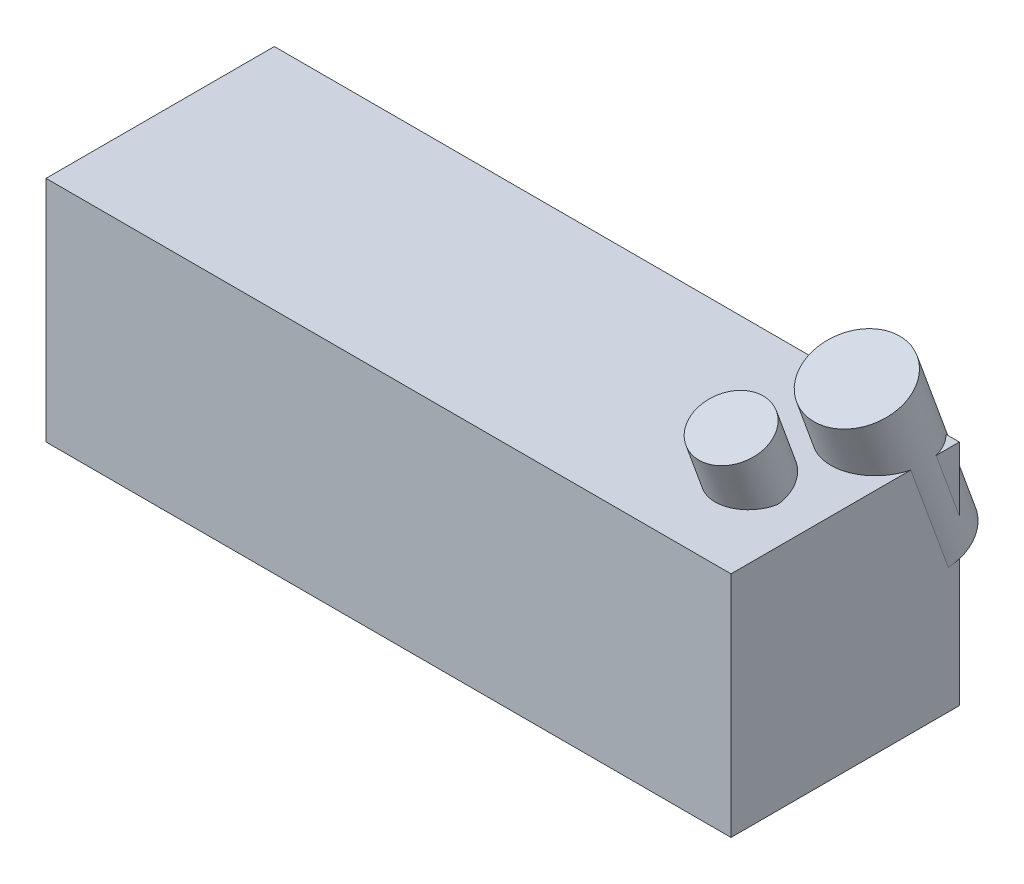
ISO-10303-21;
HEADER;
FILE_DESCRIPTION(('STEP AP214'),'2;1');
FILE_NAME('part.step','',(''),(''),'','','');
FILE_SCHEMA(('AUTOMOTIVE_DESIGN { 1 0 10303 214 1 1 1 1 }'));
ENDSEC;
DATA;
#1=APPLICATION_CONTEXT('core data for automotive mechanical design processes');
#2=APPLICATION_PROTOCOL_DEFINITION('international standard','automotive_design',2000,#1);
#3=PRODUCT_CONTEXT('',#1,'mechanical');
#4=PRODUCT('Part','Part','',(#3));
#5=PRODUCT_RELATED_PRODUCT_CATEGORY('part','',(#4));
#6=PRODUCT_DEFINITION_FORMATION('','',#4);
#7=PRODUCT_DEFINITION_CONTEXT('part definition',#1,'design');
#8=PRODUCT_DEFINITION('design','',#6,#7);
#9=PRODUCT_DEFINITION_SHAPE('','',#8);
#10=(LENGTH_UNIT() NAMED_UNIT(*) SI_UNIT(.MILLI.,.METRE.));
#11=(NAMED_UNIT(*) PLANE_ANGLE_UNIT() SI_UNIT($,.RADIAN.));
#12=(NAMED_UNIT(*) SI_UNIT($,.STERADIAN.) SOLID_ANGLE_UNIT());
#13=UNCERTAINTY_MEASURE_WITH_UNIT(LENGTH_MEASURE(1.E-05),#10,'distance_accuracy_value','');
#14=(GEOMETRIC_REPRESENTATION_CONTEXT(3) GLOBAL_UNCERTAINTY_ASSIGNED_CONTEXT((#13)) GLOBAL_UNIT_ASSIGNED_CONTEXT((#10,
#11,#12)) REPRESENTATION_CONTEXT('',''));
#15=CARTESIAN_POINT('',(0.,0.,0.));
#16=DIRECTION('',(0.,0.,1.));
#17=DIRECTION('',(1.,0.,0.));
#18=AXIS2_PLACEMENT_3D('',#15,#16,#17);
#19=CARTESIAN_POINT('',(-6.14867557934673,18.0831328357846,13.8390907622559));
#20=DIRECTION('',(0.,-0.939692620785908,-0.342020143325669));
#21=DIRECTION('',(0.,0.342020143325669,-0.939692620785908));
#22=AXIS2_PLACEMENT_3D('',#19,#20,#21);
#23=CYLINDRICAL_SURFACE('',#22,3.);
#24=CARTESIAN_POINT('',(-6.14867557934673,18.0831328357846,13.8390907622559));
#25=DIRECTION('',(0.,0.939692620785908,0.342020143325669));
#26=DIRECTION('',(0.,-0.342020143325669,0.939692620785908));
#27=AXIS2_PLACEMENT_3D('',#24,#25,#26);
#28=CIRCLE('',#27,3.);
#29=CARTESIAN_POINT('',(-6.14867557934673,17.0570724058076,16.6581686246136));
#30=VERTEX_POINT('',#29);
#31=EDGE_CURVE('E11',#30,#30,#28,.T.);
#32=ORIENTED_EDGE('',*,*,#31,.F.);
#33=EDGE_LOOP('',(#32));
#34=FACE_BOUND('',#33,.T.);
#35=CARTESIAN_POINT('',(-6.14867557934673,13.384669731855,12.1289900456275));
#36=DIRECTION('',(0.,0.939692620785908,0.342020143325669));
#37=DIRECTION('',(0.,-0.342020143325669,0.939692620785908));
#38=AXIS2_PLACEMENT_3D('',#35,#36,#37);
#39=CIRCLE('',#38,3.);
#40=CARTESIAN_POINT('',(-6.14867557934673,12.358609301878,14.9480679079853));
#41=VERTEX_POINT('',#40);
#42=EDGE_CURVE('E44',#41,#41,#39,.T.);
#43=ORIENTED_EDGE('',*,*,#42,.T.);
#44=EDGE_LOOP('',(#43));
#45=FACE_BOUND('',#44,.T.);
#46=ADVANCED_FACE('F41',(#34,#45),#23,.T.);
#47=CARTESIAN_POINT('',(-6.14867557934673,18.0831328357846,13.8390907622559));
#48=DIRECTION('',(0.,0.939692620785908,0.342020143325669));
#49=DIRECTION('',(0.,-0.342020143325669,0.939692620785908));
#50=AXIS2_PLACEMENT_3D('',#47,#48,#49);
#51=PLANE('',#50);
#52=ORIENTED_EDGE('',*,*,#31,.T.);
#53=EDGE_LOOP('',(#52));
#54=FACE_BOUND('',#53,.T.);
#55=ADVANCED_FACE('F56',(#54),#51,.T.);
#56=CARTESIAN_POINT('',(-6.14867557934673,13.384669731855,12.1289900456275));
#57=DIRECTION('',(0.,0.939692620785908,0.342020143325669));
#58=DIRECTION('',(0.,-0.342020143325669,0.939692620785908));
#59=AXIS2_PLACEMENT_3D('',#56,#57,#58);
#60=PLANE('',#59);
#61=ORIENTED_EDGE('',*,*,#42,.F.);
#62=EDGE_LOOP('',(#61));
#63=FACE_BOUND('',#62,.T.);
#64=ADVANCED_FACE('F54',(#63),#60,.F.);
#65=CLOSED_SHELL('',(#46,#55,#64));
#66=MANIFOLD_SOLID_BREP('B2',#65);
#67=CARTESIAN_POINT('',(-59.998619436584,13.1803008260403,20.));
#68=DIRECTION('',(1.,0.,0.));
#69=DIRECTION('',(0.,0.,-1.));
#70=AXIS2_PLACEMENT_3D('',#67,#68,#69);
#71=PLANE('',#70);
#72=DIRECTION('',(0.,-1.,0.));
#73=VECTOR('',#72,1.);
#74=CARTESIAN_POINT('',(-59.998619436584,13.1803008260403,0.));
#75=LINE('',#74,#73);
#76=CARTESIAN_POINT('',(-59.998619436584,13.1803008260403,0.));
#77=VERTEX_POINT('',#76);
#78=CARTESIAN_POINT('',(-59.998619436584,-6.81969917395975,0.));
#79=VERTEX_POINT('',#78);
#80=EDGE_CURVE('E175',#77,#79,#75,.T.);
#81=ORIENTED_EDGE('',*,*,#80,.T.);
#82=DIRECTION('',(0.,0.,-1.));
#83=VECTOR('',#82,1.);
#84=CARTESIAN_POINT('',(-59.998619436584,-6.81969917395975,20.));
#85=LINE('',#84,#83);
#86=CARTESIAN_POINT('',(-59.998619436584,-6.81969917395975,20.));
#87=VERTEX_POINT('',#86);
#88=EDGE_CURVE('E159',#87,#79,#85,.T.);
#89=ORIENTED_EDGE('',*,*,#88,.F.);
#90=DIRECTION('',(0.,-1.,0.));
#91=VECTOR('',#90,1.);
#92=CARTESIAN_POINT('',(-59.998619436584,13.1803008260403,20.));
#93=LINE('',#92,#91);
#94=CARTESIAN_POINT('',(-59.998619436584,13.1803008260403,20.));
#95=VERTEX_POINT('',#94);
#96=EDGE_CURVE('E176',#95,#87,#93,.T.);
#97=ORIENTED_EDGE('',*,*,#96,.F.);
#98=DIRECTION('',(0.,0.,-1.));
#99=VECTOR('',#98,1.);
#100=CARTESIAN_POINT('',(-59.998619436584,13.1803008260403,20.));
#101=LINE('',#100,#99);
#102=EDGE_CURVE('E186',#95,#77,#101,.T.);
#103=ORIENTED_EDGE('',*,*,#102,.T.);
#104=EDGE_LOOP('',(#81,#89,#97,#103));
#105=FACE_BOUND('',#104,.T.);
#106=ADVANCED_FACE('F82',(#105),#71,.F.);
#107=CARTESIAN_POINT('',(-59.998619436584,-6.81969917395975,20.));
#108=DIRECTION('',(0.,1.,0.));
#109=DIRECTION('',(0.,0.,1.));
#110=AXIS2_PLACEMENT_3D('',#107,#108,#109);
#111=PLANE('',#110);
#112=DIRECTION('',(1.,0.,0.));
#113=VECTOR('',#112,1.);
#114=CARTESIAN_POINT('',(-59.998619436584,-6.81969917395975,0.));
#115=LINE('',#114,#113);
#116=CARTESIAN_POINT('',(0.00138056341597234,-6.81969917395975,0.));
#117=VERTEX_POINT('',#116);
#118=EDGE_CURVE('E189',#79,#117,#115,.T.);
#119=ORIENTED_EDGE('',*,*,#118,.T.);
#120=DIRECTION('',(0.,0.,-1.));
#121=VECTOR('',#120,1.);
#122=CARTESIAN_POINT('',(0.00138056341597234,-6.81969917395975,20.));
#123=LINE('',#122,#121);
#124=CARTESIAN_POINT('',(0.00138056341597234,-6.81969917395975,20.));
#125=VERTEX_POINT('',#124);
#126=EDGE_CURVE('E201',#125,#117,#123,.T.);
#127=ORIENTED_EDGE('',*,*,#126,.F.);
#128=DIRECTION('',(1.,0.,0.));
#129=VECTOR('',#128,1.);
#130=CARTESIAN_POINT('',(-59.998619436584,-6.81969917395975,20.));
#131=LINE('',#130,#129);
#132=EDGE_CURVE('E179',#87,#125,#131,.T.);
#133=ORIENTED_EDGE('',*,*,#132,.F.);
#134=ORIENTED_EDGE('',*,*,#88,.T.);
#135=EDGE_LOOP('',(#119,#127,#133,#134));
#136=FACE_BOUND('',#135,.T.);
#137=ADVANCED_FACE('F207',(#136),#111,.F.);
#138=CARTESIAN_POINT('',(0.00138056341597234,13.1803008260403,20.));
#139=DIRECTION('',(-1.,0.,0.));
#140=DIRECTION('',(0.,0.,1.));
#141=AXIS2_PLACEMENT_3D('',#138,#139,#140);
#142=PLANE('',#141);
#143=DIRECTION('',(0.,0.342020143325669,-0.939692620785908));
#144=VECTOR('',#143,1.);
#145=CARTESIAN_POINT('',(0.00138056341597234,-0.91508848574837,14.869697850115));
#146=LINE('',#145,#144);
#147=CARTESIAN_POINT('',(0.00138056341597234,4.14502948230057,0.967137993123924));
#148=VERTEX_POINT('',#147);
#149=CARTESIAN_POINT('',(0.00138056341597234,4.49703892422563,0.));
#150=VERTEX_POINT('',#149);
#151=EDGE_CURVE('E96',#148,#150,#146,.T.);
#152=ORIENTED_EDGE('',*,*,#151,.F.);
#153=DIRECTION('',(0.,0.939692620785908,0.342020143325669));
#154=VECTOR('',#153,1.);
#155=CARTESIAN_POINT('',(0.00138056341597234,4.14502948230057,0.967137993123924));
#156=LINE('',#155,#154);
#157=CARTESIAN_POINT('',(0.00138056341597234,13.1803008260403,4.25570782076357));
#158=VERTEX_POINT('',#157);
#159=EDGE_CURVE('E100',#148,#158,#156,.T.);
#160=ORIENTED_EDGE('',*,*,#159,.T.);
#161=DIRECTION('',(0.,0.,-1.));
#162=VECTOR('',#161,1.);
#163=CARTESIAN_POINT('',(0.00138056341597234,13.1803008260403,20.));
#164=LINE('',#163,#162);
#165=CARTESIAN_POINT('',(0.00138056341597234,13.1803008260403,20.));
#166=VERTEX_POINT('',#165);
#167=EDGE_CURVE('E199',#166,#158,#164,.T.);
#168=ORIENTED_EDGE('',*,*,#167,.F.);
#169=DIRECTION('',(0.,1.,0.));
#170=VECTOR('',#169,1.);
#171=CARTESIAN_POINT('',(0.00138056341597234,13.1803008260403,20.));
#172=LINE('',#171,#170);
#173=EDGE_CURVE('E182',#125,#166,#172,.T.);
#174=ORIENTED_EDGE('',*,*,#173,.F.);
#175=ORIENTED_EDGE('',*,*,#126,.T.);
#176=DIRECTION('',(0.,1.,0.));
#177=VECTOR('',#176,1.);
#178=CARTESIAN_POINT('',(0.00138056341597234,13.1803008260403,0.));
#179=LINE('',#178,#177);
#180=EDGE_CURVE('E192',#117,#150,#179,.T.);
#181=ORIENTED_EDGE('',*,*,#180,.T.);
#182=EDGE_LOOP('',(#152,#160,#168,#174,#175,#181));
#183=FACE_BOUND('',#182,.T.);
#184=ADVANCED_FACE('F212',(#183),#142,.F.);
#185=CARTESIAN_POINT('',(-59.998619436584,13.1803008260403,20.));
#186=DIRECTION('',(0.,-1.,0.));
#187=DIRECTION('',(0.,0.,-1.));
#188=AXIS2_PLACEMENT_3D('',#185,#186,#187);
#189=PLANE('',#188);
#190=ORIENTED_EDGE('',*,*,#167,.T.);
#191=CARTESIAN_POINT('',(-3.86035838416277,13.1803008260403,3.14621774438584));
#192=DIRECTION('',(0.,-1.,0.));
#193=DIRECTION('',(0.,0.,1.));
#194=AXIS2_PLACEMENT_3D('',#191,#192,#193);
#195=ELLIPSE('',#194,4.25671108990365,4.);
#196=CARTESIAN_POINT('',(-6.55465610598104,13.1803008260403,0.));
#197=VERTEX_POINT('',#196);
#198=EDGE_CURVE('E171',#158,#197,#195,.T.);
#199=ORIENTED_EDGE('',*,*,#198,.T.);
#200=DIRECTION('',(-1.,0.,0.));
#201=VECTOR('',#200,1.);
#202=CARTESIAN_POINT('',(-59.998619436584,13.1803008260403,0.));
#203=LINE('',#202,#201);
#204=EDGE_CURVE('E151',#197,#77,#203,.T.);
#205=ORIENTED_EDGE('',*,*,#204,.T.);
#206=ORIENTED_EDGE('',*,*,#102,.F.);
#207=DIRECTION('',(-1.,0.,0.));
#208=VECTOR('',#207,1.);
#209=CARTESIAN_POINT('',(-59.998619436584,13.1803008260403,20.));
#210=LINE('',#209,#208);
#211=EDGE_CURVE('E184',#166,#95,#210,.T.);
#212=ORIENTED_EDGE('',*,*,#211,.F.);
#213=EDGE_LOOP('',(#190,#199,#205,#206,#212));
#214=FACE_BOUND('',#213,.T.);
#215=ADVANCED_FACE('F218',(#214),#189,.F.);
#216=CARTESIAN_POINT('',(0.,0.,20.));
#217=DIRECTION('',(0.,0.,1.));
#218=DIRECTION('',(1.,0.,0.));
#219=AXIS2_PLACEMENT_3D('',#216,#217,#218);
#220=PLANE('',#219);
#221=ORIENTED_EDGE('',*,*,#96,.T.);
#222=ORIENTED_EDGE('',*,*,#132,.T.);
#223=ORIENTED_EDGE('',*,*,#173,.T.);
#224=ORIENTED_EDGE('',*,*,#211,.T.);
#225=EDGE_LOOP('',(#221,#222,#223,#224));
#226=FACE_BOUND('',#225,.T.);
#227=ADVANCED_FACE('F216',(#226),#220,.T.);
#228=CARTESIAN_POINT('',(0.,0.,0.));
#229=DIRECTION('',(0.,0.,1.));
#230=DIRECTION('',(1.,0.,0.));
#231=AXIS2_PLACEMENT_3D('',#228,#229,#230);
#232=PLANE('',#231);
#233=ORIENTED_EDGE('',*,*,#204,.F.);
#234=CARTESIAN_POINT('',(-3.86035838416277,4.53613861665273,0.));
#235=DIRECTION('',(0.,0.,1.));
#236=DIRECTION('',(0.,1.,0.));
#237=AXIS2_PLACEMENT_3D('',#234,#235,#236);
#238=ELLIPSE('',#237,11.6952176006523,4.);
#239=CARTESIAN_POINT('',(-7.86033602985231,4.49703892422563,0.));
#240=VERTEX_POINT('',#239);
#241=EDGE_CURVE('E85',#197,#240,#238,.T.);
#242=ORIENTED_EDGE('',*,*,#241,.T.);
#243=DIRECTION('',(-1.,0.,0.));
#244=VECTOR('',#243,1.);
#245=CARTESIAN_POINT('',(0.,4.49703892422563,0.));
#246=LINE('',#245,#244);
#247=EDGE_CURVE('E149',#150,#240,#246,.T.);
#248=ORIENTED_EDGE('',*,*,#247,.F.);
#249=ORIENTED_EDGE('',*,*,#180,.F.);
#250=ORIENTED_EDGE('',*,*,#118,.F.);
#251=ORIENTED_EDGE('',*,*,#80,.F.);
#252=EDGE_LOOP('',(#233,#242,#248,#249,#250,#251));
#253=FACE_BOUND('',#252,.T.);
#254=ADVANCED_FACE('F147',(#253),#232,.F.);
#255=CARTESIAN_POINT('',(-3.86035838416277,4.50161271938346,-0.0125663989173474));
#256=DIRECTION('',(0.,0.939692620785908,0.342020143325669));
#257=DIRECTION('',(0.,-0.342020143325669,0.939692620785908));
#258=AXIS2_PLACEMENT_3D('',#255,#256,#257);
#259=CYLINDRICAL_SURFACE('',#258,4.);
#260=DIRECTION('',(0.,0.939692620785908,0.342020143325669));
#261=VECTOR('',#260,1.);
#262=CARTESIAN_POINT('',(0.00138056341597234,4.85819595646635,-0.992270790958619));
#263=LINE('',#262,#261);
#264=CARTESIAN_POINT('',(0.00138056341597234,13.1803008260403,2.03672766800811));
#265=VERTEX_POINT('',#264);
#266=CARTESIAN_POINT('',(0.00138056341597234,7.58443754860952,0.));
#267=VERTEX_POINT('',#266);
#268=EDGE_CURVE('E170',#265,#267,#263,.F.);
#269=ORIENTED_EDGE('',*,*,#268,.F.);
#270=CARTESIAN_POINT('',(-1.1660606623445,13.1803008260403,0.));
#271=VERTEX_POINT('',#270);
#272=EDGE_CURVE('E163',#271,#265,#195,.T.);
#273=ORIENTED_EDGE('',*,*,#272,.F.);
#274=EDGE_CURVE('E39',#267,#271,#238,.T.);
#275=ORIENTED_EDGE('',*,*,#274,.F.);
#276=EDGE_LOOP('',(#269,#273,#275));
#277=FACE_BOUND('',#276,.T.);
#278=CARTESIAN_POINT('',(-3.86035838416277,18.5970020311721,5.11773575096769));
#279=DIRECTION('',(0.,0.939692620785908,0.342020143325669));
#280=DIRECTION('',(0.,-0.342020143325669,0.939692620785908));
#281=AXIS2_PLACEMENT_3D('',#278,#279,#280);
#282=CIRCLE('',#281,4.);
#283=CARTESIAN_POINT('',(-3.86035838416277,17.2289214578694,8.87650623411133));
#284=VERTEX_POINT('',#283);
#285=EDGE_CURVE('E161',#284,#284,#282,.T.);
#286=ORIENTED_EDGE('',*,*,#285,.F.);
#287=EDGE_LOOP('',(#286));
#288=FACE_BOUND('',#287,.T.);
#289=ORIENTED_EDGE('',*,*,#159,.F.);
#290=CARTESIAN_POINT('',(-3.86035838416277,4.50161271938346,-0.0125663989173474));
#291=DIRECTION('',(0.,0.939692620785908,0.342020143325669));
#292=DIRECTION('',(0.,-0.342020143325669,0.939692620785908));
#293=AXIS2_PLACEMENT_3D('',#290,#291,#292);
#294=CIRCLE('',#293,4.);
#295=EDGE_CURVE('E158',#148,#240,#294,.T.);
#296=ORIENTED_EDGE('',*,*,#295,.T.);
#297=ORIENTED_EDGE('',*,*,#241,.F.);
#298=ORIENTED_EDGE('',*,*,#198,.F.);
#299=EDGE_LOOP('',(#289,#296,#297,#298));
#300=FACE_BOUND('',#299,.T.);
#301=ADVANCED_FACE('F160',(#277,#288,#300),#259,.T.);
#302=CARTESIAN_POINT('',(-3.86035838416277,4.50161271938346,-0.0125663989173474));
#303=DIRECTION('',(0.,0.939692620785908,0.342020143325669));
#304=DIRECTION('',(0.,-0.342020143325669,0.939692620785908));
#305=AXIS2_PLACEMENT_3D('',#302,#303,#304);
#306=PLANE('',#305);
#307=ORIENTED_EDGE('',*,*,#295,.F.);
#308=ORIENTED_EDGE('',*,*,#151,.T.);
#309=ORIENTED_EDGE('',*,*,#247,.T.);
#310=EDGE_LOOP('',(#307,#308,#309));
#311=FACE_BOUND('',#310,.T.);
#312=ADVANCED_FACE('F157',(#311),#306,.F.);
#313=CARTESIAN_POINT('',(-3.86035838416277,18.5970020311721,5.11773575096769));
#314=DIRECTION('',(0.,0.939692620785908,0.342020143325669));
#315=DIRECTION('',(0.,-0.342020143325669,0.939692620785908));
#316=AXIS2_PLACEMENT_3D('',#313,#314,#315);
#317=PLANE('',#316);
#318=ORIENTED_EDGE('',*,*,#285,.T.);
#319=EDGE_LOOP('',(#318));
#320=FACE_BOUND('',#319,.T.);
#321=ADVANCED_FACE('F277',(#320),#317,.T.);
#322=CARTESIAN_POINT('',(0.00138056341597234,13.1803008260403,0.));
#323=VERTEX_POINT('',#322);
#324=EDGE_CURVE('E191',#267,#323,#179,.T.);
#325=ORIENTED_EDGE('',*,*,#324,.F.);
#326=ORIENTED_EDGE('',*,*,#274,.T.);
#327=EDGE_CURVE('E180',#323,#271,#203,.T.);
#328=ORIENTED_EDGE('',*,*,#327,.F.);
#329=EDGE_LOOP('',(#325,#326,#328));
#330=FACE_BOUND('',#329,.T.);
#331=ADVANCED_FACE('F231',(#330),#232,.F.);
#332=ORIENTED_EDGE('',*,*,#327,.T.);
#333=ORIENTED_EDGE('',*,*,#272,.T.);
#334=EDGE_CURVE('E198',#265,#323,#164,.T.);
#335=ORIENTED_EDGE('',*,*,#334,.T.);
#336=EDGE_LOOP('',(#332,#333,#335));
#337=FACE_BOUND('',#336,.T.);
#338=ADVANCED_FACE('F221',(#337),#189,.F.);
#339=ORIENTED_EDGE('',*,*,#334,.F.);
#340=ORIENTED_EDGE('',*,*,#268,.T.);
#341=ORIENTED_EDGE('',*,*,#324,.T.);
#342=EDGE_LOOP('',(#339,#340,#341));
#343=FACE_BOUND('',#342,.T.);
#344=ADVANCED_FACE('F228',(#343),#142,.F.);
#345=CLOSED_SHELL('',(#106,#137,#184,#215,#227,#254,#301,#312,#321,#331,#338,#344));
#346=MANIFOLD_SOLID_BREP('B6',#345);
#347=ADVANCED_BREP_SHAPE_REPRESENTATION('',(#18,#66,#346),#14);
#348=SHAPE_DEFINITION_REPRESENTATION(#9,#347);
ENDSEC;
END-ISO-10303-21;
